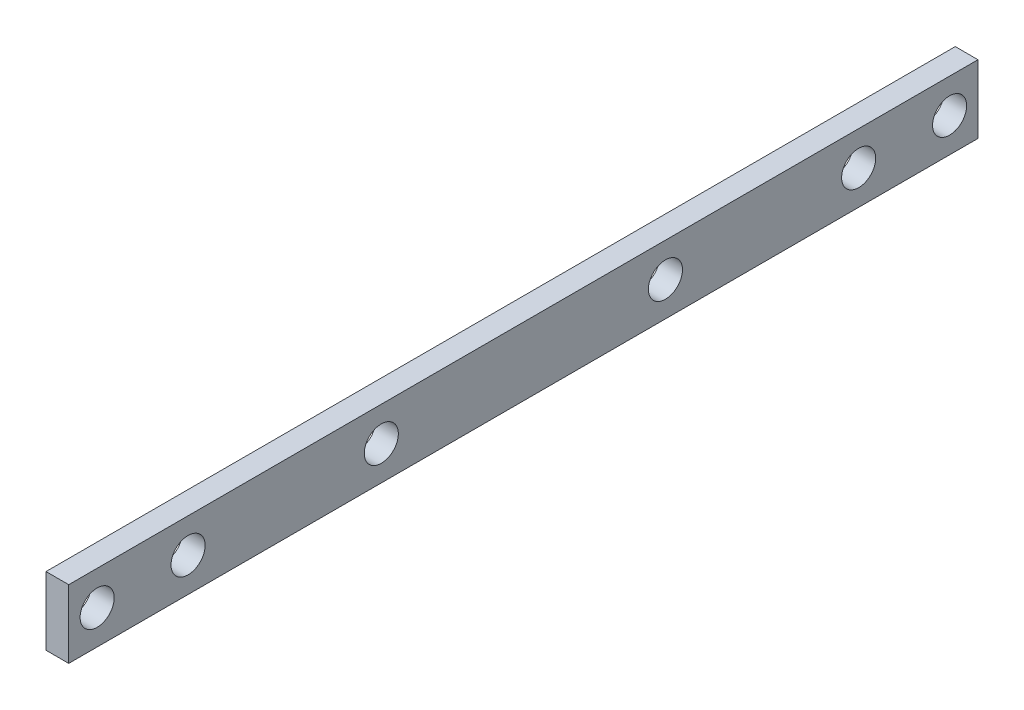
ISO-10303-21;
HEADER;
FILE_DESCRIPTION(('STEP AP214'),'2;1');
FILE_NAME('part.step','',(''),(''),'','','');
FILE_SCHEMA(('AUTOMOTIVE_DESIGN { 1 0 10303 214 1 1 1 1 }'));
ENDSEC;
DATA;
#1=APPLICATION_CONTEXT('core data for automotive mechanical design processes');
#2=APPLICATION_PROTOCOL_DEFINITION('international standard','automotive_design',2000,#1);
#3=PRODUCT_CONTEXT('',#1,'mechanical');
#4=PRODUCT('Part','Part','',(#3));
#5=PRODUCT_RELATED_PRODUCT_CATEGORY('part','',(#4));
#6=PRODUCT_DEFINITION_FORMATION('','',#4);
#7=PRODUCT_DEFINITION_CONTEXT('part definition',#1,'design');
#8=PRODUCT_DEFINITION('design','',#6,#7);
#9=PRODUCT_DEFINITION_SHAPE('','',#8);
#10=(LENGTH_UNIT() NAMED_UNIT(*) SI_UNIT(.MILLI.,.METRE.));
#11=(NAMED_UNIT(*) PLANE_ANGLE_UNIT() SI_UNIT($,.RADIAN.));
#12=(NAMED_UNIT(*) SI_UNIT($,.STERADIAN.) SOLID_ANGLE_UNIT());
#13=UNCERTAINTY_MEASURE_WITH_UNIT(LENGTH_MEASURE(1.E-05),#10,'distance_accuracy_value','');
#14=(GEOMETRIC_REPRESENTATION_CONTEXT(3) GLOBAL_UNCERTAINTY_ASSIGNED_CONTEXT((#13)) GLOBAL_UNIT_ASSIGNED_CONTEXT((#10,
#11,#12)) REPRESENTATION_CONTEXT('',''));
#15=CARTESIAN_POINT('',(0.,0.,0.));
#16=DIRECTION('',(0.,0.,1.));
#17=DIRECTION('',(1.,0.,0.));
#18=AXIS2_PLACEMENT_3D('',#15,#16,#17);
#19=CARTESIAN_POINT('',(2.,0.,0.));
#20=DIRECTION('',(-1.,0.,0.));
#21=DIRECTION('',(0.,0.,1.));
#22=AXIS2_PLACEMENT_3D('',#19,#20,#21);
#23=PLANE('',#22);
#24=CARTESIAN_POINT('',(2.,0.,-29.5));
#25=DIRECTION('',(1.,0.,0.));
#26=DIRECTION('',(0.,0.,-1.));
#27=AXIS2_PLACEMENT_3D('',#24,#25,#26);
#28=CIRCLE('',#27,1.5);
#29=CARTESIAN_POINT('',(2.,0.,-31.));
#30=VERTEX_POINT('',#29);
#31=EDGE_CURVE('E135',#30,#30,#28,.T.);
#32=ORIENTED_EDGE('',*,*,#31,.F.);
#33=EDGE_LOOP('',(#32));
#34=FACE_BOUND('',#33,.T.);
#35=CARTESIAN_POINT('',(2.,0.,12.5));
#36=DIRECTION('',(1.,0.,0.));
#37=DIRECTION('',(0.,0.,-1.));
#38=AXIS2_PLACEMENT_3D('',#35,#36,#37);
#39=CIRCLE('',#38,1.5);
#40=CARTESIAN_POINT('',(2.,0.,11.));
#41=VERTEX_POINT('',#40);
#42=EDGE_CURVE('E123',#41,#41,#39,.T.);
#43=ORIENTED_EDGE('',*,*,#42,.F.);
#44=EDGE_LOOP('',(#43));
#45=FACE_BOUND('',#44,.T.);
#46=CARTESIAN_POINT('',(2.,0.,37.5));
#47=DIRECTION('',(1.,0.,0.));
#48=DIRECTION('',(0.,0.,-1.));
#49=AXIS2_PLACEMENT_3D('',#46,#47,#48);
#50=CIRCLE('',#49,1.5);
#51=CARTESIAN_POINT('',(2.,0.,36.));
#52=VERTEX_POINT('',#51);
#53=EDGE_CURVE('E102',#52,#52,#50,.T.);
#54=ORIENTED_EDGE('',*,*,#53,.F.);
#55=EDGE_LOOP('',(#54));
#56=FACE_BOUND('',#55,.T.);
#57=DIRECTION('',(0.,1.,0.));
#58=VECTOR('',#57,1.);
#59=CARTESIAN_POINT('',(2.,-3.00000000000001,-40.));
#60=LINE('',#59,#58);
#61=CARTESIAN_POINT('',(2.,-3.00000000000001,-40.));
#62=VERTEX_POINT('',#61);
#63=CARTESIAN_POINT('',(2.,2.99999999999999,-40.));
#64=VERTEX_POINT('',#63);
#65=EDGE_CURVE('E87',#62,#64,#60,.T.);
#66=ORIENTED_EDGE('',*,*,#65,.T.);
#67=DIRECTION('',(0.,0.,1.));
#68=VECTOR('',#67,1.);
#69=CARTESIAN_POINT('',(2.,3.00000000000001,40.));
#70=LINE('',#69,#68);
#71=CARTESIAN_POINT('',(2.,3.00000000000001,40.));
#72=VERTEX_POINT('',#71);
#73=EDGE_CURVE('E82',#64,#72,#70,.T.);
#74=ORIENTED_EDGE('',*,*,#73,.T.);
#75=DIRECTION('',(0.,-1.,0.));
#76=VECTOR('',#75,1.);
#77=CARTESIAN_POINT('',(2.,-3.00000000000001,40.));
#78=LINE('',#77,#76);
#79=CARTESIAN_POINT('',(2.,-3.00000000000001,40.));
#80=VERTEX_POINT('',#79);
#81=EDGE_CURVE('E85',#72,#80,#78,.T.);
#82=ORIENTED_EDGE('',*,*,#81,.T.);
#83=DIRECTION('',(0.,0.,-1.));
#84=VECTOR('',#83,1.);
#85=CARTESIAN_POINT('',(2.,-3.00000000000001,40.));
#86=LINE('',#85,#84);
#87=EDGE_CURVE('E52',#80,#62,#86,.T.);
#88=ORIENTED_EDGE('',*,*,#87,.T.);
#89=EDGE_LOOP('',(#66,#74,#82,#88));
#90=FACE_BOUND('',#89,.T.);
#91=CARTESIAN_POINT('',(2.,0.,29.5));
#92=DIRECTION('',(1.,0.,0.));
#93=DIRECTION('',(0.,0.,-1.));
#94=AXIS2_PLACEMENT_3D('',#91,#92,#93);
#95=CIRCLE('',#94,1.5);
#96=CARTESIAN_POINT('',(2.,0.,28.));
#97=VERTEX_POINT('',#96);
#98=EDGE_CURVE('E117',#97,#97,#95,.T.);
#99=ORIENTED_EDGE('',*,*,#98,.F.);
#100=EDGE_LOOP('',(#99));
#101=FACE_BOUND('',#100,.T.);
#102=CARTESIAN_POINT('',(2.,0.,-12.5));
#103=DIRECTION('',(1.,0.,0.));
#104=DIRECTION('',(0.,0.,-1.));
#105=AXIS2_PLACEMENT_3D('',#102,#103,#104);
#106=CIRCLE('',#105,1.5);
#107=CARTESIAN_POINT('',(2.,0.,-14.));
#108=VERTEX_POINT('',#107);
#109=EDGE_CURVE('E129',#108,#108,#106,.T.);
#110=ORIENTED_EDGE('',*,*,#109,.F.);
#111=EDGE_LOOP('',(#110));
#112=FACE_BOUND('',#111,.T.);
#113=CARTESIAN_POINT('',(2.,0.,-37.5));
#114=DIRECTION('',(1.,0.,0.));
#115=DIRECTION('',(0.,0.,-1.));
#116=AXIS2_PLACEMENT_3D('',#113,#114,#115);
#117=CIRCLE('',#116,1.5);
#118=CARTESIAN_POINT('',(2.,0.,-39.));
#119=VERTEX_POINT('',#118);
#120=EDGE_CURVE('E141',#119,#119,#117,.T.);
#121=ORIENTED_EDGE('',*,*,#120,.F.);
#122=EDGE_LOOP('',(#121));
#123=FACE_BOUND('',#122,.T.);
#124=ADVANCED_FACE('F35',(#34,#45,#56,#90,#101,#112,#123),#23,.F.);
#125=CARTESIAN_POINT('',(0.,0.,0.));
#126=DIRECTION('',(-1.,0.,0.));
#127=DIRECTION('',(0.,0.,1.));
#128=AXIS2_PLACEMENT_3D('',#125,#126,#127);
#129=PLANE('',#128);
#130=CARTESIAN_POINT('',(0.,0.,-29.5));
#131=DIRECTION('',(1.,0.,0.));
#132=DIRECTION('',(0.,0.,-1.));
#133=AXIS2_PLACEMENT_3D('',#130,#131,#132);
#134=CIRCLE('',#133,1.5);
#135=CARTESIAN_POINT('',(0.,0.,-31.));
#136=VERTEX_POINT('',#135);
#137=EDGE_CURVE('E138',#136,#136,#134,.T.);
#138=ORIENTED_EDGE('',*,*,#137,.T.);
#139=EDGE_LOOP('',(#138));
#140=FACE_BOUND('',#139,.T.);
#141=CARTESIAN_POINT('',(0.,0.,12.5));
#142=DIRECTION('',(1.,0.,0.));
#143=DIRECTION('',(0.,0.,-1.));
#144=AXIS2_PLACEMENT_3D('',#141,#142,#143);
#145=CIRCLE('',#144,1.5);
#146=CARTESIAN_POINT('',(0.,0.,11.));
#147=VERTEX_POINT('',#146);
#148=EDGE_CURVE('E126',#147,#147,#145,.T.);
#149=ORIENTED_EDGE('',*,*,#148,.T.);
#150=EDGE_LOOP('',(#149));
#151=FACE_BOUND('',#150,.T.);
#152=CARTESIAN_POINT('',(0.,0.,37.5));
#153=DIRECTION('',(1.,0.,0.));
#154=DIRECTION('',(0.,0.,-1.));
#155=AXIS2_PLACEMENT_3D('',#152,#153,#154);
#156=CIRCLE('',#155,1.5);
#157=CARTESIAN_POINT('',(0.,0.,36.));
#158=VERTEX_POINT('',#157);
#159=EDGE_CURVE('E114',#158,#158,#156,.T.);
#160=ORIENTED_EDGE('',*,*,#159,.T.);
#161=EDGE_LOOP('',(#160));
#162=FACE_BOUND('',#161,.T.);
#163=DIRECTION('',(0.,1.,0.));
#164=VECTOR('',#163,1.);
#165=CARTESIAN_POINT('',(0.,-3.00000000000001,-40.));
#166=LINE('',#165,#164);
#167=CARTESIAN_POINT('',(0.,-3.00000000000001,-40.));
#168=VERTEX_POINT('',#167);
#169=CARTESIAN_POINT('',(0.,2.99999999999999,-40.));
#170=VERTEX_POINT('',#169);
#171=EDGE_CURVE('E99',#168,#170,#166,.T.);
#172=ORIENTED_EDGE('',*,*,#171,.F.);
#173=DIRECTION('',(0.,0.,-1.));
#174=VECTOR('',#173,1.);
#175=CARTESIAN_POINT('',(0.,-3.00000000000001,40.));
#176=LINE('',#175,#174);
#177=CARTESIAN_POINT('',(0.,-3.00000000000001,40.));
#178=VERTEX_POINT('',#177);
#179=EDGE_CURVE('E75',#178,#168,#176,.T.);
#180=ORIENTED_EDGE('',*,*,#179,.F.);
#181=DIRECTION('',(0.,-1.,0.));
#182=VECTOR('',#181,1.);
#183=CARTESIAN_POINT('',(0.,-3.00000000000001,40.));
#184=LINE('',#183,#182);
#185=CARTESIAN_POINT('',(0.,3.00000000000001,40.));
#186=VERTEX_POINT('',#185);
#187=EDGE_CURVE('E69',#186,#178,#184,.T.);
#188=ORIENTED_EDGE('',*,*,#187,.F.);
#189=DIRECTION('',(0.,0.,1.));
#190=VECTOR('',#189,1.);
#191=CARTESIAN_POINT('',(0.,3.00000000000001,40.));
#192=LINE('',#191,#190);
#193=EDGE_CURVE('E91',#170,#186,#192,.T.);
#194=ORIENTED_EDGE('',*,*,#193,.F.);
#195=EDGE_LOOP('',(#172,#180,#188,#194));
#196=FACE_BOUND('',#195,.T.);
#197=CARTESIAN_POINT('',(0.,0.,29.5));
#198=DIRECTION('',(1.,0.,0.));
#199=DIRECTION('',(0.,0.,-1.));
#200=AXIS2_PLACEMENT_3D('',#197,#198,#199);
#201=CIRCLE('',#200,1.5);
#202=CARTESIAN_POINT('',(0.,0.,28.));
#203=VERTEX_POINT('',#202);
#204=EDGE_CURVE('E120',#203,#203,#201,.T.);
#205=ORIENTED_EDGE('',*,*,#204,.T.);
#206=EDGE_LOOP('',(#205));
#207=FACE_BOUND('',#206,.T.);
#208=CARTESIAN_POINT('',(0.,0.,-12.5));
#209=DIRECTION('',(1.,0.,0.));
#210=DIRECTION('',(0.,0.,-1.));
#211=AXIS2_PLACEMENT_3D('',#208,#209,#210);
#212=CIRCLE('',#211,1.5);
#213=CARTESIAN_POINT('',(0.,0.,-14.));
#214=VERTEX_POINT('',#213);
#215=EDGE_CURVE('E132',#214,#214,#212,.T.);
#216=ORIENTED_EDGE('',*,*,#215,.T.);
#217=EDGE_LOOP('',(#216));
#218=FACE_BOUND('',#217,.T.);
#219=CARTESIAN_POINT('',(0.,0.,-37.5));
#220=DIRECTION('',(1.,0.,0.));
#221=DIRECTION('',(0.,0.,-1.));
#222=AXIS2_PLACEMENT_3D('',#219,#220,#221);
#223=CIRCLE('',#222,1.5);
#224=CARTESIAN_POINT('',(0.,0.,-39.));
#225=VERTEX_POINT('',#224);
#226=EDGE_CURVE('E144',#225,#225,#223,.T.);
#227=ORIENTED_EDGE('',*,*,#226,.T.);
#228=EDGE_LOOP('',(#227));
#229=FACE_BOUND('',#228,.T.);
#230=ADVANCED_FACE('F110',(#140,#151,#162,#196,#207,#218,#229),#129,.T.);
#231=CARTESIAN_POINT('',(2.,-3.00000000000001,-40.));
#232=DIRECTION('',(0.,0.,1.));
#233=DIRECTION('',(1.,0.,0.));
#234=AXIS2_PLACEMENT_3D('',#231,#232,#233);
#235=PLANE('',#234);
#236=ORIENTED_EDGE('',*,*,#171,.T.);
#237=DIRECTION('',(-1.,0.,0.));
#238=VECTOR('',#237,1.);
#239=CARTESIAN_POINT('',(2.,2.99999999999999,-40.));
#240=LINE('',#239,#238);
#241=EDGE_CURVE('E11',#64,#170,#240,.T.);
#242=ORIENTED_EDGE('',*,*,#241,.F.);
#243=ORIENTED_EDGE('',*,*,#65,.F.);
#244=DIRECTION('',(-1.,0.,0.));
#245=VECTOR('',#244,1.);
#246=CARTESIAN_POINT('',(2.,-3.00000000000001,-40.));
#247=LINE('',#246,#245);
#248=EDGE_CURVE('E95',#62,#168,#247,.T.);
#249=ORIENTED_EDGE('',*,*,#248,.T.);
#250=EDGE_LOOP('',(#236,#242,#243,#249));
#251=FACE_BOUND('',#250,.T.);
#252=ADVANCED_FACE('F37',(#251),#235,.F.);
#253=CARTESIAN_POINT('',(2.,3.00000000000001,40.));
#254=DIRECTION('',(0.,-1.,0.));
#255=DIRECTION('',(0.,0.,-1.));
#256=AXIS2_PLACEMENT_3D('',#253,#254,#255);
#257=PLANE('',#256);
#258=ORIENTED_EDGE('',*,*,#193,.T.);
#259=DIRECTION('',(-1.,0.,0.));
#260=VECTOR('',#259,1.);
#261=CARTESIAN_POINT('',(2.,3.00000000000001,40.));
#262=LINE('',#261,#260);
#263=EDGE_CURVE('E44',#72,#186,#262,.T.);
#264=ORIENTED_EDGE('',*,*,#263,.F.);
#265=ORIENTED_EDGE('',*,*,#73,.F.);
#266=ORIENTED_EDGE('',*,*,#241,.T.);
#267=EDGE_LOOP('',(#258,#264,#265,#266));
#268=FACE_BOUND('',#267,.T.);
#269=ADVANCED_FACE('F90',(#268),#257,.F.);
#270=CARTESIAN_POINT('',(2.,-3.00000000000001,40.));
#271=DIRECTION('',(0.,0.,-1.));
#272=DIRECTION('',(-1.,0.,0.));
#273=AXIS2_PLACEMENT_3D('',#270,#271,#272);
#274=PLANE('',#273);
#275=ORIENTED_EDGE('',*,*,#187,.T.);
#276=DIRECTION('',(-1.,0.,0.));
#277=VECTOR('',#276,1.);
#278=CARTESIAN_POINT('',(2.,-3.00000000000001,40.));
#279=LINE('',#278,#277);
#280=EDGE_CURVE('E92',#80,#178,#279,.T.);
#281=ORIENTED_EDGE('',*,*,#280,.F.);
#282=ORIENTED_EDGE('',*,*,#81,.F.);
#283=ORIENTED_EDGE('',*,*,#263,.T.);
#284=EDGE_LOOP('',(#275,#281,#282,#283));
#285=FACE_BOUND('',#284,.T.);
#286=ADVANCED_FACE('F93',(#285),#274,.F.);
#287=CARTESIAN_POINT('',(2.,-3.00000000000001,40.));
#288=DIRECTION('',(0.,1.,0.));
#289=DIRECTION('',(0.,0.,1.));
#290=AXIS2_PLACEMENT_3D('',#287,#288,#289);
#291=PLANE('',#290);
#292=ORIENTED_EDGE('',*,*,#179,.T.);
#293=ORIENTED_EDGE('',*,*,#248,.F.);
#294=ORIENTED_EDGE('',*,*,#87,.F.);
#295=ORIENTED_EDGE('',*,*,#280,.T.);
#296=EDGE_LOOP('',(#292,#293,#294,#295));
#297=FACE_BOUND('',#296,.T.);
#298=ADVANCED_FACE('F107',(#297),#291,.F.);
#299=CARTESIAN_POINT('',(2.,0.,37.5));
#300=DIRECTION('',(-1.,0.,0.));
#301=DIRECTION('',(0.,0.,1.));
#302=AXIS2_PLACEMENT_3D('',#299,#300,#301);
#303=CYLINDRICAL_SURFACE('',#302,1.5);
#304=ORIENTED_EDGE('',*,*,#53,.T.);
#305=EDGE_LOOP('',(#304));
#306=FACE_BOUND('',#305,.T.);
#307=ORIENTED_EDGE('',*,*,#159,.F.);
#308=EDGE_LOOP('',(#307));
#309=FACE_BOUND('',#308,.T.);
#310=ADVANCED_FACE('F164',(#306,#309),#303,.F.);
#311=CARTESIAN_POINT('',(2.,0.,29.5));
#312=DIRECTION('',(-1.,0.,0.));
#313=DIRECTION('',(0.,0.,1.));
#314=AXIS2_PLACEMENT_3D('',#311,#312,#313);
#315=CYLINDRICAL_SURFACE('',#314,1.5);
#316=ORIENTED_EDGE('',*,*,#98,.T.);
#317=EDGE_LOOP('',(#316));
#318=FACE_BOUND('',#317,.T.);
#319=ORIENTED_EDGE('',*,*,#204,.F.);
#320=EDGE_LOOP('',(#319));
#321=FACE_BOUND('',#320,.T.);
#322=ADVANCED_FACE('F210',(#318,#321),#315,.F.);
#323=CARTESIAN_POINT('',(2.,0.,12.5));
#324=DIRECTION('',(-1.,0.,0.));
#325=DIRECTION('',(0.,0.,1.));
#326=AXIS2_PLACEMENT_3D('',#323,#324,#325);
#327=CYLINDRICAL_SURFACE('',#326,1.5);
#328=ORIENTED_EDGE('',*,*,#42,.T.);
#329=EDGE_LOOP('',(#328));
#330=FACE_BOUND('',#329,.T.);
#331=ORIENTED_EDGE('',*,*,#148,.F.);
#332=EDGE_LOOP('',(#331));
#333=FACE_BOUND('',#332,.T.);
#334=ADVANCED_FACE('F218',(#330,#333),#327,.F.);
#335=CARTESIAN_POINT('',(2.,0.,-12.5));
#336=DIRECTION('',(-1.,0.,0.));
#337=DIRECTION('',(0.,0.,1.));
#338=AXIS2_PLACEMENT_3D('',#335,#336,#337);
#339=CYLINDRICAL_SURFACE('',#338,1.5);
#340=ORIENTED_EDGE('',*,*,#109,.T.);
#341=EDGE_LOOP('',(#340));
#342=FACE_BOUND('',#341,.T.);
#343=ORIENTED_EDGE('',*,*,#215,.F.);
#344=EDGE_LOOP('',(#343));
#345=FACE_BOUND('',#344,.T.);
#346=ADVANCED_FACE('F226',(#342,#345),#339,.F.);
#347=CARTESIAN_POINT('',(2.,0.,-29.5));
#348=DIRECTION('',(-1.,0.,0.));
#349=DIRECTION('',(0.,0.,1.));
#350=AXIS2_PLACEMENT_3D('',#347,#348,#349);
#351=CYLINDRICAL_SURFACE('',#350,1.5);
#352=ORIENTED_EDGE('',*,*,#31,.T.);
#353=EDGE_LOOP('',(#352));
#354=FACE_BOUND('',#353,.T.);
#355=ORIENTED_EDGE('',*,*,#137,.F.);
#356=EDGE_LOOP('',(#355));
#357=FACE_BOUND('',#356,.T.);
#358=ADVANCED_FACE('F235',(#354,#357),#351,.F.);
#359=CARTESIAN_POINT('',(2.,0.,-37.5));
#360=DIRECTION('',(-1.,0.,0.));
#361=DIRECTION('',(0.,0.,1.));
#362=AXIS2_PLACEMENT_3D('',#359,#360,#361);
#363=CYLINDRICAL_SURFACE('',#362,1.5);
#364=ORIENTED_EDGE('',*,*,#120,.T.);
#365=EDGE_LOOP('',(#364));
#366=FACE_BOUND('',#365,.T.);
#367=ORIENTED_EDGE('',*,*,#226,.F.);
#368=EDGE_LOOP('',(#367));
#369=FACE_BOUND('',#368,.T.);
#370=ADVANCED_FACE('F150',(#366,#369),#363,.F.);
#371=CLOSED_SHELL('',(#124,#230,#252,#269,#286,#298,#310,#322,#334,#346,#358,#370));
#372=MANIFOLD_SOLID_BREP('B2',#371);
#373=ADVANCED_BREP_SHAPE_REPRESENTATION('',(#18,#372),#14);
#374=SHAPE_DEFINITION_REPRESENTATION(#9,#373);
ENDSEC;
END-ISO-10303-21;
